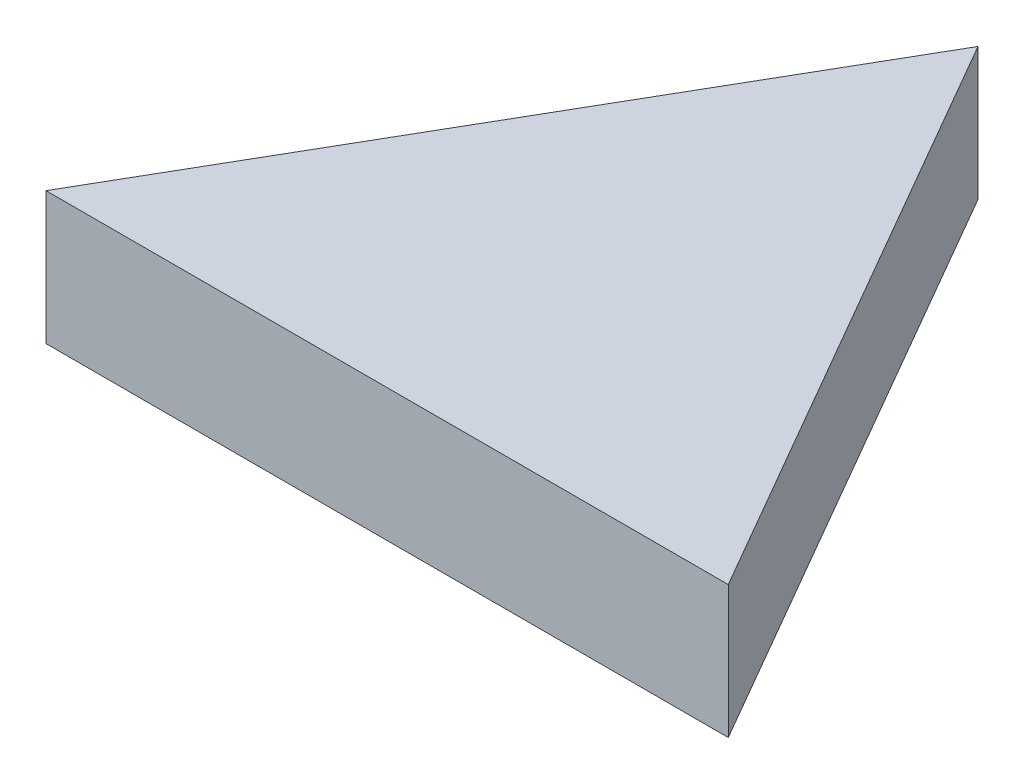
ISO-10303-21;
HEADER;
FILE_DESCRIPTION(('STEP AP214'),'2;1');
FILE_NAME('part.step','',(''),(''),'','','');
FILE_SCHEMA(('AUTOMOTIVE_DESIGN { 1 0 10303 214 1 1 1 1 }'));
ENDSEC;
DATA;
#1=APPLICATION_CONTEXT('core data for automotive mechanical design processes');
#2=APPLICATION_PROTOCOL_DEFINITION('international standard','automotive_design',2000,#1);
#3=PRODUCT_CONTEXT('',#1,'mechanical');
#4=PRODUCT('Part','Part','',(#3));
#5=PRODUCT_RELATED_PRODUCT_CATEGORY('part','',(#4));
#6=PRODUCT_DEFINITION_FORMATION('','',#4);
#7=PRODUCT_DEFINITION_CONTEXT('part definition',#1,'design');
#8=PRODUCT_DEFINITION('design','',#6,#7);
#9=PRODUCT_DEFINITION_SHAPE('','',#8);
#10=(LENGTH_UNIT() NAMED_UNIT(*) SI_UNIT(.MILLI.,.METRE.));
#11=(NAMED_UNIT(*) PLANE_ANGLE_UNIT() SI_UNIT($,.RADIAN.));
#12=(NAMED_UNIT(*) SI_UNIT($,.STERADIAN.) SOLID_ANGLE_UNIT());
#13=UNCERTAINTY_MEASURE_WITH_UNIT(LENGTH_MEASURE(1.E-05),#10,'distance_accuracy_value','');
#14=(GEOMETRIC_REPRESENTATION_CONTEXT(3) GLOBAL_UNCERTAINTY_ASSIGNED_CONTEXT((#13)) GLOBAL_UNIT_ASSIGNED_CONTEXT((#10,
#11,#12)) REPRESENTATION_CONTEXT('',''));
#15=CARTESIAN_POINT('',(0.,0.,0.));
#16=DIRECTION('',(0.,0.,1.));
#17=DIRECTION('',(1.,0.,0.));
#18=AXIS2_PLACEMENT_3D('',#15,#16,#17);
#19=CARTESIAN_POINT('',(927.03,360.,-1605.66306014058));
#20=DIRECTION('',(0.866025403784439,0.,0.5));
#21=DIRECTION('',(0.5,0.,-0.866025403784439));
#22=AXIS2_PLACEMENT_3D('',#19,#20,#21);
#23=PLANE('',#22);
#24=DIRECTION('',(-0.5,0.,0.866025403784439));
#25=VECTOR('',#24,1.);
#26=CARTESIAN_POINT('',(927.03,0.,-1605.66306014058));
#27=LINE('',#26,#25);
#28=CARTESIAN_POINT('',(927.03,0.,-1605.66306014058));
#29=VERTEX_POINT('',#28);
#30=CARTESIAN_POINT('',(0.,0.,0.));
#31=VERTEX_POINT('',#30);
#32=EDGE_CURVE('E79',#29,#31,#27,.T.);
#33=ORIENTED_EDGE('',*,*,#32,.T.);
#34=DIRECTION('',(0.,-1.,0.));
#35=VECTOR('',#34,1.);
#36=CARTESIAN_POINT('',(0.,360.,0.));
#37=LINE('',#36,#35);
#38=CARTESIAN_POINT('',(0.,360.,0.));
#39=VERTEX_POINT('',#38);
#40=EDGE_CURVE('E11',#39,#31,#37,.T.);
#41=ORIENTED_EDGE('',*,*,#40,.F.);
#42=DIRECTION('',(-0.5,0.,0.866025403784439));
#43=VECTOR('',#42,1.);
#44=CARTESIAN_POINT('',(927.03,360.,-1605.66306014058));
#45=LINE('',#44,#43);
#46=CARTESIAN_POINT('',(927.03,360.,-1605.66306014058));
#47=VERTEX_POINT('',#46);
#48=EDGE_CURVE('E72',#47,#39,#45,.T.);
#49=ORIENTED_EDGE('',*,*,#48,.F.);
#50=DIRECTION('',(0.,-1.,0.));
#51=VECTOR('',#50,1.);
#52=CARTESIAN_POINT('',(927.03,360.,-1605.66306014058));
#53=LINE('',#52,#51);
#54=EDGE_CURVE('E80',#47,#29,#53,.T.);
#55=ORIENTED_EDGE('',*,*,#54,.T.);
#56=EDGE_LOOP('',(#33,#41,#49,#55));
#57=FACE_BOUND('',#56,.T.);
#58=ADVANCED_FACE('F32',(#57),#23,.F.);
#59=CARTESIAN_POINT('',(0.,360.,0.));
#60=DIRECTION('',(0.,0.,-1.));
#61=DIRECTION('',(-1.,0.,0.));
#62=AXIS2_PLACEMENT_3D('',#59,#60,#61);
#63=PLANE('',#62);
#64=DIRECTION('',(1.,0.,0.));
#65=VECTOR('',#64,1.);
#66=CARTESIAN_POINT('',(0.,0.,0.));
#67=LINE('',#66,#65);
#68=CARTESIAN_POINT('',(1854.06,0.,0.));
#69=VERTEX_POINT('',#68);
#70=EDGE_CURVE('E60',#31,#69,#67,.T.);
#71=ORIENTED_EDGE('',*,*,#70,.T.);
#72=DIRECTION('',(0.,-1.,0.));
#73=VECTOR('',#72,1.);
#74=CARTESIAN_POINT('',(1854.06,360.,0.));
#75=LINE('',#74,#73);
#76=CARTESIAN_POINT('',(1854.06,360.,0.));
#77=VERTEX_POINT('',#76);
#78=EDGE_CURVE('E40',#77,#69,#75,.T.);
#79=ORIENTED_EDGE('',*,*,#78,.F.);
#80=DIRECTION('',(1.,0.,0.));
#81=VECTOR('',#80,1.);
#82=CARTESIAN_POINT('',(0.,360.,0.));
#83=LINE('',#82,#81);
#84=EDGE_CURVE('E68',#39,#77,#83,.T.);
#85=ORIENTED_EDGE('',*,*,#84,.F.);
#86=ORIENTED_EDGE('',*,*,#40,.T.);
#87=EDGE_LOOP('',(#71,#79,#85,#86));
#88=FACE_BOUND('',#87,.T.);
#89=ADVANCED_FACE('F69',(#88),#63,.F.);
#90=CARTESIAN_POINT('',(1854.06,360.,0.));
#91=DIRECTION('',(-0.866025403784439,0.,0.5));
#92=DIRECTION('',(0.5,0.,0.866025403784439));
#93=AXIS2_PLACEMENT_3D('',#90,#91,#92);
#94=PLANE('',#93);
#95=DIRECTION('',(-0.5,0.,-0.866025403784439));
#96=VECTOR('',#95,1.);
#97=CARTESIAN_POINT('',(1854.06,0.,0.));
#98=LINE('',#97,#96);
#99=EDGE_CURVE('E65',#69,#29,#98,.T.);
#100=ORIENTED_EDGE('',*,*,#99,.T.);
#101=ORIENTED_EDGE('',*,*,#54,.F.);
#102=DIRECTION('',(-0.5,0.,-0.866025403784439));
#103=VECTOR('',#102,1.);
#104=CARTESIAN_POINT('',(1854.06,360.,0.));
#105=LINE('',#104,#103);
#106=EDGE_CURVE('E48',#77,#47,#105,.T.);
#107=ORIENTED_EDGE('',*,*,#106,.F.);
#108=ORIENTED_EDGE('',*,*,#78,.T.);
#109=EDGE_LOOP('',(#100,#101,#107,#108));
#110=FACE_BOUND('',#109,.T.);
#111=ADVANCED_FACE('F87',(#110),#94,.F.);
#112=CARTESIAN_POINT('',(0.,360.,0.));
#113=DIRECTION('',(0.,1.,0.));
#114=DIRECTION('',(0.,0.,1.));
#115=AXIS2_PLACEMENT_3D('',#112,#113,#114);
#116=PLANE('',#115);
#117=ORIENTED_EDGE('',*,*,#48,.T.);
#118=ORIENTED_EDGE('',*,*,#84,.T.);
#119=ORIENTED_EDGE('',*,*,#106,.T.);
#120=EDGE_LOOP('',(#117,#118,#119));
#121=FACE_BOUND('',#120,.T.);
#122=ADVANCED_FACE('F75',(#121),#116,.T.);
#123=CARTESIAN_POINT('',(0.,0.,0.));
#124=DIRECTION('',(0.,1.,0.));
#125=DIRECTION('',(0.,0.,1.));
#126=AXIS2_PLACEMENT_3D('',#123,#124,#125);
#127=PLANE('',#126);
#128=ORIENTED_EDGE('',*,*,#32,.F.);
#129=ORIENTED_EDGE('',*,*,#99,.F.);
#130=ORIENTED_EDGE('',*,*,#70,.F.);
#131=EDGE_LOOP('',(#128,#129,#130));
#132=FACE_BOUND('',#131,.T.);
#133=ADVANCED_FACE('F88',(#132),#127,.F.);
#134=CLOSED_SHELL('',(#58,#89,#111,#122,#133));
#135=MANIFOLD_SOLID_BREP('B2',#134);
#136=ADVANCED_BREP_SHAPE_REPRESENTATION('',(#18,#135),#14);
#137=SHAPE_DEFINITION_REPRESENTATION(#9,#136);
ENDSEC;
END-ISO-10303-21;
